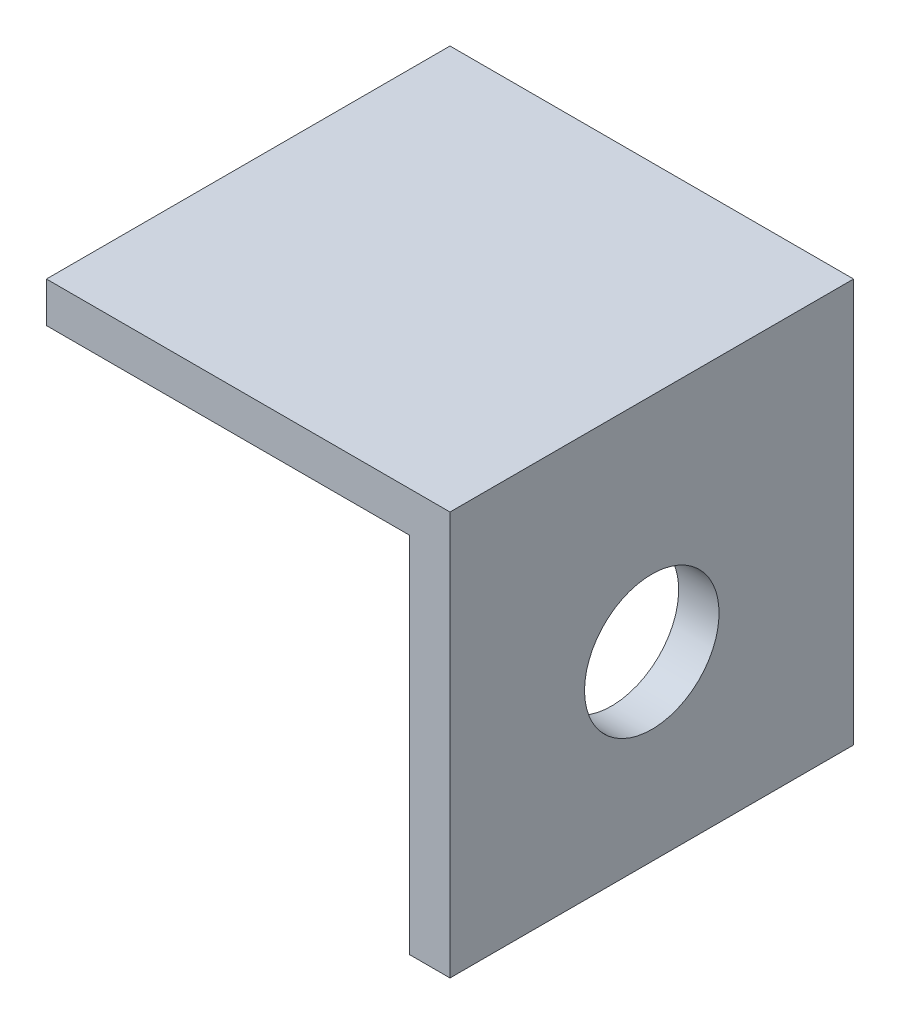
ISO-10303-21;
HEADER;
FILE_DESCRIPTION(('STEP AP214'),'2;1');
FILE_NAME('part.step','',(''),(''),'','','');
FILE_SCHEMA(('AUTOMOTIVE_DESIGN { 1 0 10303 214 1 1 1 1 }'));
ENDSEC;
DATA;
#1=APPLICATION_CONTEXT('core data for automotive mechanical design processes');
#2=APPLICATION_PROTOCOL_DEFINITION('international standard','automotive_design',2000,#1);
#3=PRODUCT_CONTEXT('',#1,'mechanical');
#4=PRODUCT('Part','Part','',(#3));
#5=PRODUCT_RELATED_PRODUCT_CATEGORY('part','',(#4));
#6=PRODUCT_DEFINITION_FORMATION('','',#4);
#7=PRODUCT_DEFINITION_CONTEXT('part definition',#1,'design');
#8=PRODUCT_DEFINITION('design','',#6,#7);
#9=PRODUCT_DEFINITION_SHAPE('','',#8);
#10=(LENGTH_UNIT() NAMED_UNIT(*) SI_UNIT(.MILLI.,.METRE.));
#11=(NAMED_UNIT(*) PLANE_ANGLE_UNIT() SI_UNIT($,.RADIAN.));
#12=(NAMED_UNIT(*) SI_UNIT($,.STERADIAN.) SOLID_ANGLE_UNIT());
#13=UNCERTAINTY_MEASURE_WITH_UNIT(LENGTH_MEASURE(1.E-05),#10,'distance_accuracy_value','');
#14=(GEOMETRIC_REPRESENTATION_CONTEXT(3) GLOBAL_UNCERTAINTY_ASSIGNED_CONTEXT((#13)) GLOBAL_UNIT_ASSIGNED_CONTEXT((#10,
#11,#12)) REPRESENTATION_CONTEXT('',''));
#15=CARTESIAN_POINT('',(0.,0.,0.));
#16=DIRECTION('',(0.,0.,1.));
#17=DIRECTION('',(1.,0.,0.));
#18=AXIS2_PLACEMENT_3D('',#15,#16,#17);
#19=CARTESIAN_POINT('',(-30.,0.,-30.));
#20=DIRECTION('',(0.,1.,0.));
#21=DIRECTION('',(0.,0.,1.));
#22=AXIS2_PLACEMENT_3D('',#19,#20,#21);
#23=PLANE('',#22);
#24=DIRECTION('',(-1.,0.,0.));
#25=VECTOR('',#24,1.);
#26=CARTESIAN_POINT('',(-30.,0.,0.));
#27=LINE('',#26,#25);
#28=CARTESIAN_POINT('',(0.,0.,0.));
#29=VERTEX_POINT('',#28);
#30=CARTESIAN_POINT('',(-30.,0.,0.));
#31=VERTEX_POINT('',#30);
#32=EDGE_CURVE('E122',#29,#31,#27,.T.);
#33=ORIENTED_EDGE('',*,*,#32,.F.);
#34=DIRECTION('',(0.,0.,1.));
#35=VECTOR('',#34,1.);
#36=CARTESIAN_POINT('',(0.,0.,-30.));
#37=LINE('',#36,#35);
#38=CARTESIAN_POINT('',(0.,0.,-30.));
#39=VERTEX_POINT('',#38);
#40=EDGE_CURVE('E11',#39,#29,#37,.T.);
#41=ORIENTED_EDGE('',*,*,#40,.F.);
#42=DIRECTION('',(-1.,0.,0.));
#43=VECTOR('',#42,1.);
#44=CARTESIAN_POINT('',(-30.,0.,-30.));
#45=LINE('',#44,#43);
#46=CARTESIAN_POINT('',(-30.,0.,-30.));
#47=VERTEX_POINT('',#46);
#48=EDGE_CURVE('E137',#39,#47,#45,.T.);
#49=ORIENTED_EDGE('',*,*,#48,.T.);
#50=DIRECTION('',(0.,0.,1.));
#51=VECTOR('',#50,1.);
#52=CARTESIAN_POINT('',(-30.,0.,-30.));
#53=LINE('',#52,#51);
#54=EDGE_CURVE('E40',#47,#31,#53,.T.);
#55=ORIENTED_EDGE('',*,*,#54,.T.);
#56=EDGE_LOOP('',(#33,#41,#49,#55));
#57=FACE_BOUND('',#56,.T.);
#58=ADVANCED_FACE('F37',(#57),#23,.T.);
#59=CARTESIAN_POINT('',(0.,0.,-30.));
#60=DIRECTION('',(1.,0.,0.));
#61=DIRECTION('',(0.,1.,0.));
#62=AXIS2_PLACEMENT_3D('',#59,#60,#61);
#63=PLANE('',#62);
#64=CARTESIAN_POINT('',(0.,-16.5,-14.9999999999992));
#65=DIRECTION('',(-1.,0.,0.));
#66=DIRECTION('',(0.,0.,1.));
#67=AXIS2_PLACEMENT_3D('',#64,#65,#66);
#68=CIRCLE('',#67,4.99999999999998);
#69=CARTESIAN_POINT('',(0.,-16.5,-9.99999999999926));
#70=VERTEX_POINT('',#69);
#71=EDGE_CURVE('E126',#70,#70,#68,.T.);
#72=ORIENTED_EDGE('',*,*,#71,.T.);
#73=EDGE_LOOP('',(#72));
#74=FACE_BOUND('',#73,.T.);
#75=DIRECTION('',(0.,1.,0.));
#76=VECTOR('',#75,1.);
#77=CARTESIAN_POINT('',(0.,0.,0.));
#78=LINE('',#77,#76);
#79=CARTESIAN_POINT('',(0.,-30.,0.));
#80=VERTEX_POINT('',#79);
#81=EDGE_CURVE('E135',#80,#29,#78,.T.);
#82=ORIENTED_EDGE('',*,*,#81,.F.);
#83=DIRECTION('',(0.,0.,1.));
#84=VECTOR('',#83,1.);
#85=CARTESIAN_POINT('',(0.,-30.,-30.));
#86=LINE('',#85,#84);
#87=CARTESIAN_POINT('',(0.,-30.,-30.));
#88=VERTEX_POINT('',#87);
#89=EDGE_CURVE('E46',#88,#80,#86,.T.);
#90=ORIENTED_EDGE('',*,*,#89,.F.);
#91=DIRECTION('',(0.,1.,0.));
#92=VECTOR('',#91,1.);
#93=CARTESIAN_POINT('',(0.,0.,-30.));
#94=LINE('',#93,#92);
#95=EDGE_CURVE('E112',#88,#39,#94,.T.);
#96=ORIENTED_EDGE('',*,*,#95,.T.);
#97=ORIENTED_EDGE('',*,*,#40,.T.);
#98=EDGE_LOOP('',(#82,#90,#96,#97));
#99=FACE_BOUND('',#98,.T.);
#100=ADVANCED_FACE('F145',(#74,#99),#63,.T.);
#101=CARTESIAN_POINT('',(0.,-30.,-30.));
#102=DIRECTION('',(0.,-1.,0.));
#103=DIRECTION('',(0.,0.,-1.));
#104=AXIS2_PLACEMENT_3D('',#101,#102,#103);
#105=PLANE('',#104);
#106=DIRECTION('',(1.,0.,0.));
#107=VECTOR('',#106,1.);
#108=CARTESIAN_POINT('',(0.,-30.,0.));
#109=LINE('',#108,#107);
#110=CARTESIAN_POINT('',(-3.,-30.,0.));
#111=VERTEX_POINT('',#110);
#112=EDGE_CURVE('E99',#111,#80,#109,.T.);
#113=ORIENTED_EDGE('',*,*,#112,.F.);
#114=DIRECTION('',(0.,0.,1.));
#115=VECTOR('',#114,1.);
#116=CARTESIAN_POINT('',(-3.,-30.,-30.));
#117=LINE('',#116,#115);
#118=CARTESIAN_POINT('',(-3.,-30.,-30.));
#119=VERTEX_POINT('',#118);
#120=EDGE_CURVE('E94',#119,#111,#117,.T.);
#121=ORIENTED_EDGE('',*,*,#120,.F.);
#122=DIRECTION('',(1.,0.,0.));
#123=VECTOR('',#122,1.);
#124=CARTESIAN_POINT('',(0.,-30.,-30.));
#125=LINE('',#124,#123);
#126=EDGE_CURVE('E97',#119,#88,#125,.T.);
#127=ORIENTED_EDGE('',*,*,#126,.T.);
#128=ORIENTED_EDGE('',*,*,#89,.T.);
#129=EDGE_LOOP('',(#113,#121,#127,#128));
#130=FACE_BOUND('',#129,.T.);
#131=ADVANCED_FACE('F96',(#130),#105,.T.);
#132=CARTESIAN_POINT('',(-3.,-30.,-30.));
#133=DIRECTION('',(-1.,0.,0.));
#134=DIRECTION('',(0.,-1.,0.));
#135=AXIS2_PLACEMENT_3D('',#132,#133,#134);
#136=PLANE('',#135);
#137=CARTESIAN_POINT('',(-2.99999999999993,-16.5,-14.9999999999992));
#138=DIRECTION('',(-1.,0.,0.));
#139=DIRECTION('',(0.,0.,1.));
#140=AXIS2_PLACEMENT_3D('',#137,#138,#139);
#141=CIRCLE('',#140,4.99999999999998);
#142=CARTESIAN_POINT('',(-2.99999999999993,-16.5,-9.99999999999926));
#143=VERTEX_POINT('',#142);
#144=EDGE_CURVE('E182',#143,#143,#141,.T.);
#145=ORIENTED_EDGE('',*,*,#144,.F.);
#146=EDGE_LOOP('',(#145));
#147=FACE_BOUND('',#146,.T.);
#148=DIRECTION('',(0.,-1.,0.));
#149=VECTOR('',#148,1.);
#150=CARTESIAN_POINT('',(-3.,-30.,0.));
#151=LINE('',#150,#149);
#152=CARTESIAN_POINT('',(-3.,-3.,0.));
#153=VERTEX_POINT('',#152);
#154=EDGE_CURVE('E132',#153,#111,#151,.T.);
#155=ORIENTED_EDGE('',*,*,#154,.F.);
#156=DIRECTION('',(0.,0.,1.));
#157=VECTOR('',#156,1.);
#158=CARTESIAN_POINT('',(-3.,-3.,-30.));
#159=LINE('',#158,#157);
#160=CARTESIAN_POINT('',(-3.,-3.,-30.));
#161=VERTEX_POINT('',#160);
#162=EDGE_CURVE('E104',#161,#153,#159,.T.);
#163=ORIENTED_EDGE('',*,*,#162,.F.);
#164=DIRECTION('',(0.,-1.,0.));
#165=VECTOR('',#164,1.);
#166=CARTESIAN_POINT('',(-3.,-30.,-30.));
#167=LINE('',#166,#165);
#168=EDGE_CURVE('E110',#161,#119,#167,.T.);
#169=ORIENTED_EDGE('',*,*,#168,.T.);
#170=ORIENTED_EDGE('',*,*,#120,.T.);
#171=EDGE_LOOP('',(#155,#163,#169,#170));
#172=FACE_BOUND('',#171,.T.);
#173=ADVANCED_FACE('F114',(#147,#172),#136,.T.);
#174=CARTESIAN_POINT('',(-3.,-3.,-30.));
#175=DIRECTION('',(0.,-1.,0.));
#176=DIRECTION('',(1.,0.,0.));
#177=AXIS2_PLACEMENT_3D('',#174,#175,#176);
#178=PLANE('',#177);
#179=DIRECTION('',(1.,0.,0.));
#180=VECTOR('',#179,1.);
#181=CARTESIAN_POINT('',(-3.,-3.,0.));
#182=LINE('',#181,#180);
#183=CARTESIAN_POINT('',(-30.,-3.,0.));
#184=VERTEX_POINT('',#183);
#185=EDGE_CURVE('E129',#184,#153,#182,.T.);
#186=ORIENTED_EDGE('',*,*,#185,.F.);
#187=DIRECTION('',(0.,0.,1.));
#188=VECTOR('',#187,1.);
#189=CARTESIAN_POINT('',(-30.,-3.,-30.));
#190=LINE('',#189,#188);
#191=CARTESIAN_POINT('',(-30.,-3.,-30.));
#192=VERTEX_POINT('',#191);
#193=EDGE_CURVE('E140',#192,#184,#190,.T.);
#194=ORIENTED_EDGE('',*,*,#193,.F.);
#195=DIRECTION('',(1.,0.,0.));
#196=VECTOR('',#195,1.);
#197=CARTESIAN_POINT('',(-3.,-3.,-30.));
#198=LINE('',#197,#196);
#199=EDGE_CURVE('E115',#192,#161,#198,.T.);
#200=ORIENTED_EDGE('',*,*,#199,.T.);
#201=ORIENTED_EDGE('',*,*,#162,.T.);
#202=EDGE_LOOP('',(#186,#194,#200,#201));
#203=FACE_BOUND('',#202,.T.);
#204=ADVANCED_FACE('F161',(#203),#178,.T.);
#205=CARTESIAN_POINT('',(-30.,-3.,-30.));
#206=DIRECTION('',(-1.,0.,0.));
#207=DIRECTION('',(0.,0.,1.));
#208=AXIS2_PLACEMENT_3D('',#205,#206,#207);
#209=PLANE('',#208);
#210=DIRECTION('',(0.,-1.,0.));
#211=VECTOR('',#210,1.);
#212=CARTESIAN_POINT('',(-30.,-3.,0.));
#213=LINE('',#212,#211);
#214=EDGE_CURVE('E125',#31,#184,#213,.T.);
#215=ORIENTED_EDGE('',*,*,#214,.F.);
#216=ORIENTED_EDGE('',*,*,#54,.F.);
#217=DIRECTION('',(0.,-1.,0.));
#218=VECTOR('',#217,1.);
#219=CARTESIAN_POINT('',(-30.,-3.,-30.));
#220=LINE('',#219,#218);
#221=EDGE_CURVE('E117',#47,#192,#220,.T.);
#222=ORIENTED_EDGE('',*,*,#221,.T.);
#223=ORIENTED_EDGE('',*,*,#193,.T.);
#224=EDGE_LOOP('',(#215,#216,#222,#223));
#225=FACE_BOUND('',#224,.T.);
#226=ADVANCED_FACE('F142',(#225),#209,.T.);
#227=CARTESIAN_POINT('',(0.,0.,-30.));
#228=DIRECTION('',(0.,0.,-1.));
#229=DIRECTION('',(-1.,0.,0.));
#230=AXIS2_PLACEMENT_3D('',#227,#228,#229);
#231=PLANE('',#230);
#232=ORIENTED_EDGE('',*,*,#48,.F.);
#233=ORIENTED_EDGE('',*,*,#95,.F.);
#234=ORIENTED_EDGE('',*,*,#126,.F.);
#235=ORIENTED_EDGE('',*,*,#168,.F.);
#236=ORIENTED_EDGE('',*,*,#199,.F.);
#237=ORIENTED_EDGE('',*,*,#221,.F.);
#238=EDGE_LOOP('',(#232,#233,#234,#235,#236,#237));
#239=FACE_BOUND('',#238,.T.);
#240=ADVANCED_FACE('F108',(#239),#231,.T.);
#241=CARTESIAN_POINT('',(0.,0.,0.));
#242=DIRECTION('',(0.,0.,-1.));
#243=DIRECTION('',(-1.,0.,0.));
#244=AXIS2_PLACEMENT_3D('',#241,#242,#243);
#245=PLANE('',#244);
#246=ORIENTED_EDGE('',*,*,#32,.T.);
#247=ORIENTED_EDGE('',*,*,#214,.T.);
#248=ORIENTED_EDGE('',*,*,#185,.T.);
#249=ORIENTED_EDGE('',*,*,#154,.T.);
#250=ORIENTED_EDGE('',*,*,#112,.T.);
#251=ORIENTED_EDGE('',*,*,#81,.T.);
#252=EDGE_LOOP('',(#246,#247,#248,#249,#250,#251));
#253=FACE_BOUND('',#252,.T.);
#254=ADVANCED_FACE('F144',(#253),#245,.F.);
#255=CARTESIAN_POINT('',(-2.99999999999993,-16.5,-14.9999999999992));
#256=DIRECTION('',(-1.,0.,0.));
#257=DIRECTION('',(0.,0.,1.));
#258=AXIS2_PLACEMENT_3D('',#255,#256,#257);
#259=CYLINDRICAL_SURFACE('',#258,4.99999999999998);
#260=ORIENTED_EDGE('',*,*,#71,.F.);
#261=EDGE_LOOP('',(#260));
#262=FACE_BOUND('',#261,.T.);
#263=ORIENTED_EDGE('',*,*,#144,.T.);
#264=EDGE_LOOP('',(#263));
#265=FACE_BOUND('',#264,.T.);
#266=ADVANCED_FACE('F172',(#262,#265),#259,.F.);
#267=CLOSED_SHELL('',(#58,#100,#131,#173,#204,#226,#240,#254,#266));
#268=MANIFOLD_SOLID_BREP('B2',#267);
#269=ADVANCED_BREP_SHAPE_REPRESENTATION('',(#18,#268),#14);
#270=SHAPE_DEFINITION_REPRESENTATION(#9,#269);
ENDSEC;
END-ISO-10303-21;
